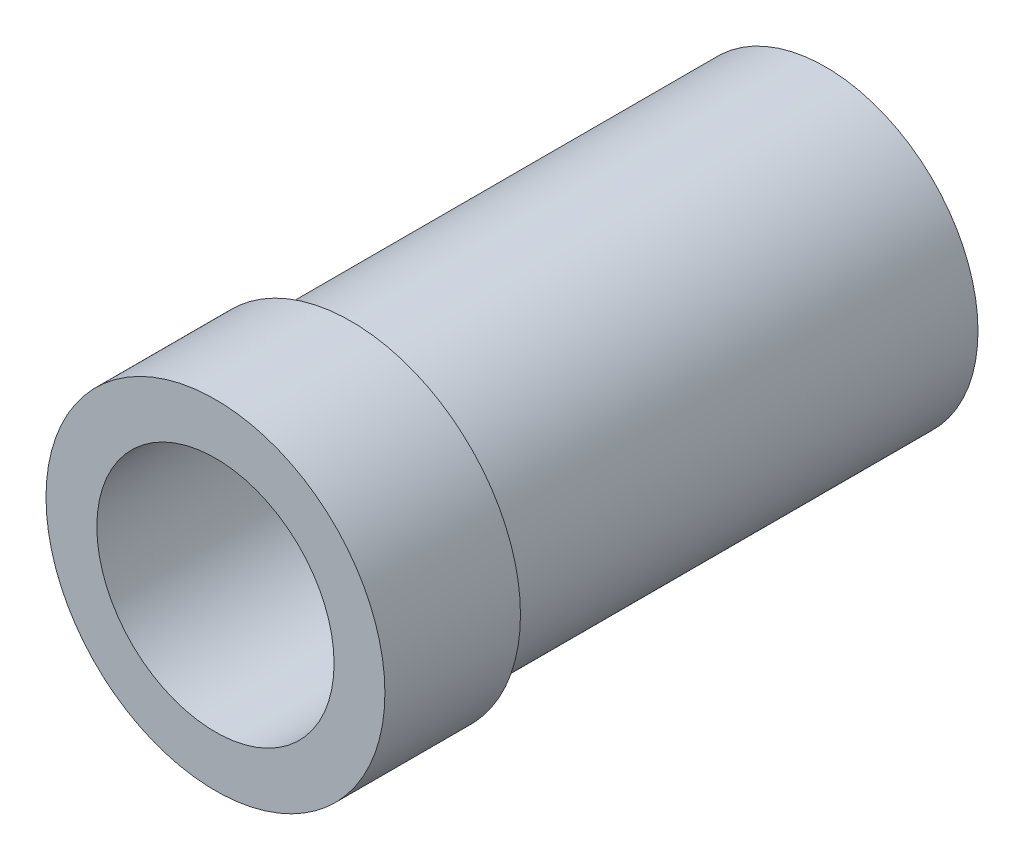
ISO-10303-21;
HEADER;
FILE_DESCRIPTION(('STEP AP214'),'2;1');
FILE_NAME('part.step','',(''),(''),'','','');
FILE_SCHEMA(('AUTOMOTIVE_DESIGN { 1 0 10303 214 1 1 1 1 }'));
ENDSEC;
DATA;
#1=APPLICATION_CONTEXT('core data for automotive mechanical design processes');
#2=APPLICATION_PROTOCOL_DEFINITION('international standard','automotive_design',2000,#1);
#3=PRODUCT_CONTEXT('',#1,'mechanical');
#4=PRODUCT('Part','Part','',(#3));
#5=PRODUCT_RELATED_PRODUCT_CATEGORY('part','',(#4));
#6=PRODUCT_DEFINITION_FORMATION('','',#4);
#7=PRODUCT_DEFINITION_CONTEXT('part definition',#1,'design');
#8=PRODUCT_DEFINITION('design','',#6,#7);
#9=PRODUCT_DEFINITION_SHAPE('','',#8);
#10=(LENGTH_UNIT() NAMED_UNIT(*) SI_UNIT(.MILLI.,.METRE.));
#11=(NAMED_UNIT(*) PLANE_ANGLE_UNIT() SI_UNIT($,.RADIAN.));
#12=(NAMED_UNIT(*) SI_UNIT($,.STERADIAN.) SOLID_ANGLE_UNIT());
#13=UNCERTAINTY_MEASURE_WITH_UNIT(LENGTH_MEASURE(1.E-05),#10,'distance_accuracy_value','');
#14=(GEOMETRIC_REPRESENTATION_CONTEXT(3) GLOBAL_UNCERTAINTY_ASSIGNED_CONTEXT((#13)) GLOBAL_UNIT_ASSIGNED_CONTEXT((#10,
#11,#12)) REPRESENTATION_CONTEXT('',''));
#15=CARTESIAN_POINT('',(0.,0.,0.));
#16=DIRECTION('',(0.,0.,1.));
#17=DIRECTION('',(1.,0.,0.));
#18=AXIS2_PLACEMENT_3D('',#15,#16,#17);
#19=CARTESIAN_POINT('',(0.,4.5,37.));
#20=DIRECTION('',(0.,0.,1.));
#21=DIRECTION('',(1.,0.,0.));
#22=AXIS2_PLACEMENT_3D('',#19,#20,#21);
#23=PLANE('',#22);
#24=CARTESIAN_POINT('',(0.,-4.,37.));
#25=DIRECTION('',(0.,0.,-1.));
#26=DIRECTION('',(-1.,0.,0.));
#27=AXIS2_PLACEMENT_3D('',#24,#25,#26);
#28=CIRCLE('',#27,7.);
#29=CARTESIAN_POINT('',(-7.,-4.,37.));
#30=VERTEX_POINT('',#29);
#31=EDGE_CURVE('E17',#30,#30,#28,.T.);
#32=ORIENTED_EDGE('',*,*,#31,.T.);
#33=EDGE_LOOP('',(#32));
#34=FACE_BOUND('',#33,.T.);
#35=CARTESIAN_POINT('',(0.,-4.,37.));
#36=DIRECTION('',(0.,0.,-1.));
#37=DIRECTION('',(-1.,0.,0.));
#38=AXIS2_PLACEMENT_3D('',#35,#36,#37);
#39=CIRCLE('',#38,10.);
#40=CARTESIAN_POINT('',(-10.,-4.,37.));
#41=VERTEX_POINT('',#40);
#42=EDGE_CURVE('E33',#41,#41,#39,.T.);
#43=ORIENTED_EDGE('',*,*,#42,.F.);
#44=EDGE_LOOP('',(#43));
#45=FACE_BOUND('',#44,.T.);
#46=ADVANCED_FACE('F14',(#34,#45),#23,.T.);
#47=CARTESIAN_POINT('',(0.,-4.,19.));
#48=DIRECTION('',(0.,0.,-1.));
#49=DIRECTION('',(-1.,0.,0.));
#50=AXIS2_PLACEMENT_3D('',#47,#48,#49);
#51=CYLINDRICAL_SURFACE('',#50,7.);
#52=CARTESIAN_POINT('',(0.,-4.,1.));
#53=DIRECTION('',(0.,0.,-1.));
#54=DIRECTION('',(-1.,0.,0.));
#55=AXIS2_PLACEMENT_3D('',#52,#53,#54);
#56=CIRCLE('',#55,7.);
#57=CARTESIAN_POINT('',(-7.,-4.,1.));
#58=VERTEX_POINT('',#57);
#59=EDGE_CURVE('E31',#58,#58,#56,.F.);
#60=ORIENTED_EDGE('',*,*,#59,.F.);
#61=EDGE_LOOP('',(#60));
#62=FACE_BOUND('',#61,.T.);
#63=ORIENTED_EDGE('',*,*,#31,.F.);
#64=EDGE_LOOP('',(#63));
#65=FACE_BOUND('',#64,.T.);
#66=ADVANCED_FACE('F42',(#62,#65),#51,.F.);
#67=CARTESIAN_POINT('',(0.,-4.,33.));
#68=DIRECTION('',(0.,0.,-1.));
#69=DIRECTION('',(-1.,0.,0.));
#70=AXIS2_PLACEMENT_3D('',#67,#68,#69);
#71=CYLINDRICAL_SURFACE('',#70,10.);
#72=ORIENTED_EDGE('',*,*,#42,.T.);
#73=EDGE_LOOP('',(#72));
#74=FACE_BOUND('',#73,.T.);
#75=CARTESIAN_POINT('',(0.,-4.,29.));
#76=DIRECTION('',(0.,0.,-1.));
#77=DIRECTION('',(-1.,0.,0.));
#78=AXIS2_PLACEMENT_3D('',#75,#76,#77);
#79=CIRCLE('',#78,10.);
#80=CARTESIAN_POINT('',(-10.,-4.,29.));
#81=VERTEX_POINT('',#80);
#82=EDGE_CURVE('E26',#81,#81,#79,.T.);
#83=ORIENTED_EDGE('',*,*,#82,.F.);
#84=EDGE_LOOP('',(#83));
#85=FACE_BOUND('',#84,.T.);
#86=ADVANCED_FACE('F44',(#74,#85),#71,.T.);
#87=CARTESIAN_POINT('',(0.,4.,1.));
#88=DIRECTION('',(0.,0.,-1.));
#89=DIRECTION('',(-1.,0.,0.));
#90=AXIS2_PLACEMENT_3D('',#87,#88,#89);
#91=PLANE('',#90);
#92=ORIENTED_EDGE('',*,*,#59,.T.);
#93=EDGE_LOOP('',(#92));
#94=FACE_BOUND('',#93,.T.);
#95=CARTESIAN_POINT('',(0.,-4.,1.));
#96=DIRECTION('',(0.,0.,-1.));
#97=DIRECTION('',(-1.,0.,0.));
#98=AXIS2_PLACEMENT_3D('',#95,#96,#97);
#99=CIRCLE('',#98,9.);
#100=CARTESIAN_POINT('',(-9.,-4.,1.));
#101=VERTEX_POINT('',#100);
#102=EDGE_CURVE('E21',#101,#101,#99,.F.);
#103=ORIENTED_EDGE('',*,*,#102,.F.);
#104=EDGE_LOOP('',(#103));
#105=FACE_BOUND('',#104,.T.);
#106=ADVANCED_FACE('F51',(#94,#105),#91,.T.);
#107=CARTESIAN_POINT('',(0.,5.5,29.));
#108=DIRECTION('',(0.,0.,-1.));
#109=DIRECTION('',(-1.,0.,0.));
#110=AXIS2_PLACEMENT_3D('',#107,#108,#109);
#111=PLANE('',#110);
#112=CARTESIAN_POINT('',(0.,-4.,29.));
#113=DIRECTION('',(0.,0.,-1.));
#114=DIRECTION('',(-1.,0.,0.));
#115=AXIS2_PLACEMENT_3D('',#112,#113,#114);
#116=CIRCLE('',#115,9.);
#117=CARTESIAN_POINT('',(-9.,-4.,29.));
#118=VERTEX_POINT('',#117);
#119=EDGE_CURVE('E10',#118,#118,#116,.T.);
#120=ORIENTED_EDGE('',*,*,#119,.F.);
#121=EDGE_LOOP('',(#120));
#122=FACE_BOUND('',#121,.T.);
#123=ORIENTED_EDGE('',*,*,#82,.T.);
#124=EDGE_LOOP('',(#123));
#125=FACE_BOUND('',#124,.T.);
#126=ADVANCED_FACE('F56',(#122,#125),#111,.T.);
#127=CARTESIAN_POINT('',(0.,-4.,15.));
#128=DIRECTION('',(0.,0.,-1.));
#129=DIRECTION('',(-1.,0.,0.));
#130=AXIS2_PLACEMENT_3D('',#127,#128,#129);
#131=CYLINDRICAL_SURFACE('',#130,9.);
#132=ORIENTED_EDGE('',*,*,#119,.T.);
#133=EDGE_LOOP('',(#132));
#134=FACE_BOUND('',#133,.T.);
#135=ORIENTED_EDGE('',*,*,#102,.T.);
#136=EDGE_LOOP('',(#135));
#137=FACE_BOUND('',#136,.T.);
#138=ADVANCED_FACE('F54',(#134,#137),#131,.T.);
#139=CLOSED_SHELL('',(#46,#66,#86,#106,#126,#138));
#140=MANIFOLD_SOLID_BREP('B1',#139);
#141=ADVANCED_BREP_SHAPE_REPRESENTATION('',(#18,#140),#14);
#142=SHAPE_DEFINITION_REPRESENTATION(#9,#141);
ENDSEC;
END-ISO-10303-21;
